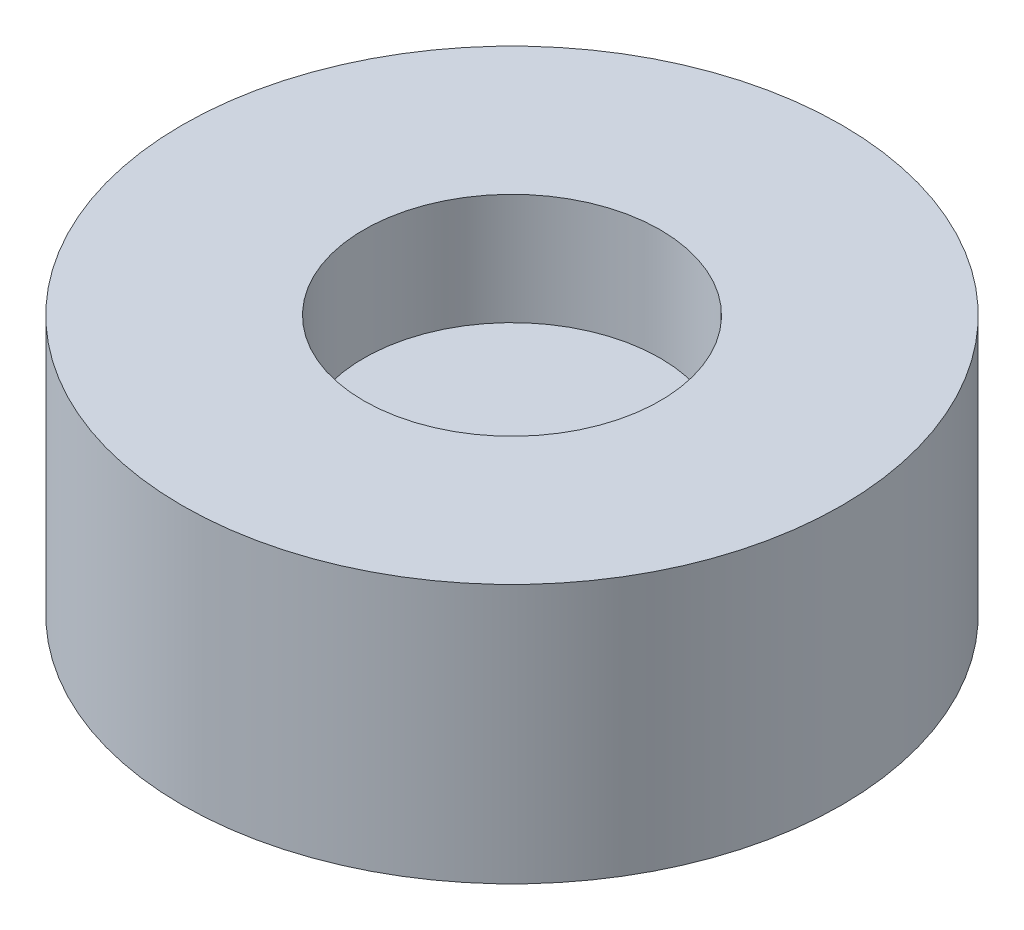
ISO-10303-21;
HEADER;
FILE_DESCRIPTION(('STEP AP214'),'2;1');
FILE_NAME('part.step','',(''),(''),'','','');
FILE_SCHEMA(('AUTOMOTIVE_DESIGN { 1 0 10303 214 1 1 1 1 }'));
ENDSEC;
DATA;
#1=APPLICATION_CONTEXT('core data for automotive mechanical design processes');
#2=APPLICATION_PROTOCOL_DEFINITION('international standard','automotive_design',2000,#1);
#3=PRODUCT_CONTEXT('',#1,'mechanical');
#4=PRODUCT('Part','Part','',(#3));
#5=PRODUCT_RELATED_PRODUCT_CATEGORY('part','',(#4));
#6=PRODUCT_DEFINITION_FORMATION('','',#4);
#7=PRODUCT_DEFINITION_CONTEXT('part definition',#1,'design');
#8=PRODUCT_DEFINITION('design','',#6,#7);
#9=PRODUCT_DEFINITION_SHAPE('','',#8);
#10=(LENGTH_UNIT() NAMED_UNIT(*) SI_UNIT(.MILLI.,.METRE.));
#11=(NAMED_UNIT(*) PLANE_ANGLE_UNIT() SI_UNIT($,.RADIAN.));
#12=(NAMED_UNIT(*) SI_UNIT($,.STERADIAN.) SOLID_ANGLE_UNIT());
#13=UNCERTAINTY_MEASURE_WITH_UNIT(LENGTH_MEASURE(1.E-05),#10,'distance_accuracy_value','');
#14=(GEOMETRIC_REPRESENTATION_CONTEXT(3) GLOBAL_UNCERTAINTY_ASSIGNED_CONTEXT((#13)) GLOBAL_UNIT_ASSIGNED_CONTEXT((#10,
#11,#12)) REPRESENTATION_CONTEXT('',''));
#15=CARTESIAN_POINT('',(0.,0.,0.));
#16=DIRECTION('',(0.,0.,1.));
#17=DIRECTION('',(1.,0.,0.));
#18=AXIS2_PLACEMENT_3D('',#15,#16,#17);
#19=CARTESIAN_POINT('',(0.,1.00000000000007,0.));
#20=DIRECTION('',(0.,1.,0.));
#21=DIRECTION('',(0.,0.,1.));
#22=AXIS2_PLACEMENT_3D('',#19,#20,#21);
#23=PLANE('',#22);
#24=CARTESIAN_POINT('',(0.,1.00000000000007,0.));
#25=DIRECTION('',(0.,-1.,0.));
#26=DIRECTION('',(0.,0.,-1.));
#27=AXIS2_PLACEMENT_3D('',#24,#25,#26);
#28=CIRCLE('',#27,8.9);
#29=CARTESIAN_POINT('',(0.,1.00000000000007,-8.9));
#30=VERTEX_POINT('',#29);
#31=EDGE_CURVE('E39',#30,#30,#28,.T.);
#32=ORIENTED_EDGE('',*,*,#31,.T.);
#33=EDGE_LOOP('',(#32));
#34=FACE_BOUND('',#33,.T.);
#35=ADVANCED_FACE('F33',(#34),#23,.F.);
#36=CARTESIAN_POINT('',(0.,8.,0.));
#37=DIRECTION('',(0.,1.,0.));
#38=DIRECTION('',(0.,0.,1.));
#39=AXIS2_PLACEMENT_3D('',#36,#37,#38);
#40=PLANE('',#39);
#41=CARTESIAN_POINT('',(0.,8.,0.));
#42=DIRECTION('',(0.,1.,0.));
#43=DIRECTION('',(0.,0.,1.));
#44=AXIS2_PLACEMENT_3D('',#41,#42,#43);
#45=CIRCLE('',#44,4.);
#46=CARTESIAN_POINT('',(0.,8.,4.));
#47=VERTEX_POINT('',#46);
#48=EDGE_CURVE('E47',#47,#47,#45,.T.);
#49=ORIENTED_EDGE('',*,*,#48,.F.);
#50=EDGE_LOOP('',(#49));
#51=FACE_BOUND('',#50,.T.);
#52=CARTESIAN_POINT('',(0.,8.,0.));
#53=DIRECTION('',(0.,-1.,0.));
#54=DIRECTION('',(0.,0.,-1.));
#55=AXIS2_PLACEMENT_3D('',#52,#53,#54);
#56=CIRCLE('',#55,8.9);
#57=CARTESIAN_POINT('',(0.,8.,-8.9));
#58=VERTEX_POINT('',#57);
#59=EDGE_CURVE('E10',#58,#58,#56,.T.);
#60=ORIENTED_EDGE('',*,*,#59,.F.);
#61=EDGE_LOOP('',(#60));
#62=FACE_BOUND('',#61,.T.);
#63=ADVANCED_FACE('F55',(#51,#62),#40,.T.);
#64=CARTESIAN_POINT('',(0.,0.,0.));
#65=DIRECTION('',(0.,-1.,0.));
#66=DIRECTION('',(0.,0.,-1.));
#67=AXIS2_PLACEMENT_3D('',#64,#65,#66);
#68=CYLINDRICAL_SURFACE('',#67,8.9);
#69=ORIENTED_EDGE('',*,*,#31,.F.);
#70=EDGE_LOOP('',(#69));
#71=FACE_BOUND('',#70,.T.);
#72=ORIENTED_EDGE('',*,*,#59,.T.);
#73=EDGE_LOOP('',(#72));
#74=FACE_BOUND('',#73,.T.);
#75=ADVANCED_FACE('F58',(#71,#74),#68,.T.);
#76=CARTESIAN_POINT('',(0.,5.,0.));
#77=DIRECTION('',(0.,1.,0.));
#78=DIRECTION('',(0.,0.,1.));
#79=AXIS2_PLACEMENT_3D('',#76,#77,#78);
#80=CYLINDRICAL_SURFACE('',#79,4.);
#81=CARTESIAN_POINT('',(0.,5.,0.));
#82=DIRECTION('',(0.,1.,0.));
#83=DIRECTION('',(0.,0.,1.));
#84=AXIS2_PLACEMENT_3D('',#81,#82,#83);
#85=CIRCLE('',#84,4.);
#86=CARTESIAN_POINT('',(0.,5.,4.));
#87=VERTEX_POINT('',#86);
#88=EDGE_CURVE('E43',#87,#87,#85,.T.);
#89=ORIENTED_EDGE('',*,*,#88,.F.);
#90=EDGE_LOOP('',(#89));
#91=FACE_BOUND('',#90,.T.);
#92=ORIENTED_EDGE('',*,*,#48,.T.);
#93=EDGE_LOOP('',(#92));
#94=FACE_BOUND('',#93,.T.);
#95=ADVANCED_FACE('F53',(#91,#94),#80,.F.);
#96=CARTESIAN_POINT('',(0.,5.,0.));
#97=DIRECTION('',(0.,1.,0.));
#98=DIRECTION('',(0.,0.,1.));
#99=AXIS2_PLACEMENT_3D('',#96,#97,#98);
#100=PLANE('',#99);
#101=ORIENTED_EDGE('',*,*,#88,.T.);
#102=EDGE_LOOP('',(#101));
#103=FACE_BOUND('',#102,.T.);
#104=ADVANCED_FACE('F68',(#103),#100,.T.);
#105=CLOSED_SHELL('',(#35,#63,#75,#95,#104));
#106=MANIFOLD_SOLID_BREP('B2',#105);
#107=ADVANCED_BREP_SHAPE_REPRESENTATION('',(#18,#106),#14);
#108=SHAPE_DEFINITION_REPRESENTATION(#9,#107);
ENDSEC;
END-ISO-10303-21;
